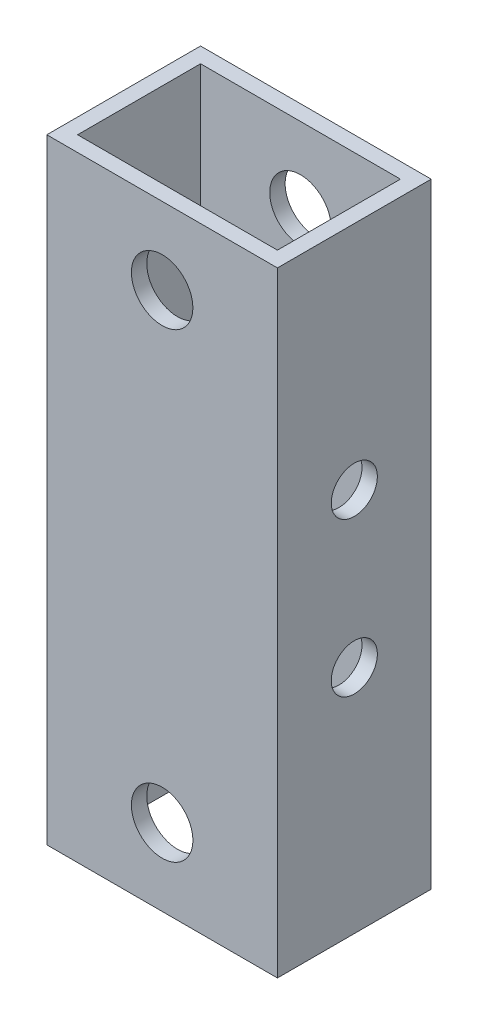
ISO-10303-21;
HEADER;
FILE_DESCRIPTION(('STEP AP214'),'2;1');
FILE_NAME('part.step','',(''),(''),'','','');
FILE_SCHEMA(('AUTOMOTIVE_DESIGN { 1 0 10303 214 1 1 1 1 }'));
ENDSEC;
DATA;
#1=APPLICATION_CONTEXT('core data for automotive mechanical design processes');
#2=APPLICATION_PROTOCOL_DEFINITION('international standard','automotive_design',2000,#1);
#3=PRODUCT_CONTEXT('',#1,'mechanical');
#4=PRODUCT('Part','Part','',(#3));
#5=PRODUCT_RELATED_PRODUCT_CATEGORY('part','',(#4));
#6=PRODUCT_DEFINITION_FORMATION('','',#4);
#7=PRODUCT_DEFINITION_CONTEXT('part definition',#1,'design');
#8=PRODUCT_DEFINITION('design','',#6,#7);
#9=PRODUCT_DEFINITION_SHAPE('','',#8);
#10=(LENGTH_UNIT() NAMED_UNIT(*) SI_UNIT(.MILLI.,.METRE.));
#11=(NAMED_UNIT(*) PLANE_ANGLE_UNIT() SI_UNIT($,.RADIAN.));
#12=(NAMED_UNIT(*) SI_UNIT($,.STERADIAN.) SOLID_ANGLE_UNIT());
#13=UNCERTAINTY_MEASURE_WITH_UNIT(LENGTH_MEASURE(1.E-05),#10,'distance_accuracy_value','');
#14=(GEOMETRIC_REPRESENTATION_CONTEXT(3) GLOBAL_UNCERTAINTY_ASSIGNED_CONTEXT((#13)) GLOBAL_UNIT_ASSIGNED_CONTEXT((#10,
#11,#12)) REPRESENTATION_CONTEXT('',''));
#15=CARTESIAN_POINT('',(0.,0.,0.));
#16=DIRECTION('',(0.,0.,1.));
#17=DIRECTION('',(1.,0.,0.));
#18=AXIS2_PLACEMENT_3D('',#15,#16,#17);
#19=CARTESIAN_POINT('',(0.,40.,0.));
#20=DIRECTION('',(0.,1.,0.));
#21=DIRECTION('',(0.,0.,1.));
#22=AXIS2_PLACEMENT_3D('',#19,#20,#21);
#23=PLANE('',#22);
#24=DIRECTION('',(0.,0.,1.));
#25=VECTOR('',#24,1.);
#26=CARTESIAN_POINT('',(0.,40.,0.));
#27=LINE('',#26,#25);
#28=CARTESIAN_POINT('',(0.,40.,-10.));
#29=VERTEX_POINT('',#28);
#30=CARTESIAN_POINT('',(0.,40.,0.));
#31=VERTEX_POINT('',#30);
#32=EDGE_CURVE('E164',#29,#31,#27,.T.);
#33=ORIENTED_EDGE('',*,*,#32,.T.);
#34=DIRECTION('',(1.,0.,0.));
#35=VECTOR('',#34,1.);
#36=CARTESIAN_POINT('',(0.,40.,0.));
#37=LINE('',#36,#35);
#38=CARTESIAN_POINT('',(15.,40.,0.));
#39=VERTEX_POINT('',#38);
#40=EDGE_CURVE('E167',#31,#39,#37,.T.);
#41=ORIENTED_EDGE('',*,*,#40,.T.);
#42=DIRECTION('',(0.,0.,-1.));
#43=VECTOR('',#42,1.);
#44=CARTESIAN_POINT('',(15.,40.,0.));
#45=LINE('',#44,#43);
#46=CARTESIAN_POINT('',(15.,40.,-10.));
#47=VERTEX_POINT('',#46);
#48=EDGE_CURVE('E170',#39,#47,#45,.T.);
#49=ORIENTED_EDGE('',*,*,#48,.T.);
#50=DIRECTION('',(-1.,0.,0.));
#51=VECTOR('',#50,1.);
#52=CARTESIAN_POINT('',(0.,40.,-10.));
#53=LINE('',#52,#51);
#54=EDGE_CURVE('E172',#47,#29,#53,.T.);
#55=ORIENTED_EDGE('',*,*,#54,.T.);
#56=EDGE_LOOP('',(#33,#41,#49,#55));
#57=FACE_BOUND('',#56,.T.);
#58=DIRECTION('',(1.,0.,0.));
#59=VECTOR('',#58,1.);
#60=CARTESIAN_POINT('',(0.,40.,-1.));
#61=LINE('',#60,#59);
#62=CARTESIAN_POINT('',(1.,40.,-1.));
#63=VERTEX_POINT('',#62);
#64=CARTESIAN_POINT('',(14.,40.,-1.));
#65=VERTEX_POINT('',#64);
#66=EDGE_CURVE('E134',#63,#65,#61,.T.);
#67=ORIENTED_EDGE('',*,*,#66,.F.);
#68=DIRECTION('',(0.,0.,1.));
#69=VECTOR('',#68,1.);
#70=CARTESIAN_POINT('',(1.,40.,0.));
#71=LINE('',#70,#69);
#72=CARTESIAN_POINT('',(1.,40.,-9.));
#73=VERTEX_POINT('',#72);
#74=EDGE_CURVE('E126',#73,#63,#71,.T.);
#75=ORIENTED_EDGE('',*,*,#74,.F.);
#76=DIRECTION('',(-1.,0.,0.));
#77=VECTOR('',#76,1.);
#78=CARTESIAN_POINT('',(0.,40.,-9.));
#79=LINE('',#78,#77);
#80=CARTESIAN_POINT('',(14.,40.,-9.));
#81=VERTEX_POINT('',#80);
#82=EDGE_CURVE('E148',#81,#73,#79,.T.);
#83=ORIENTED_EDGE('',*,*,#82,.F.);
#84=DIRECTION('',(0.,0.,-1.));
#85=VECTOR('',#84,1.);
#86=CARTESIAN_POINT('',(14.,40.,0.));
#87=LINE('',#86,#85);
#88=EDGE_CURVE('E146',#65,#81,#87,.T.);
#89=ORIENTED_EDGE('',*,*,#88,.F.);
#90=EDGE_LOOP('',(#67,#75,#83,#89));
#91=FACE_BOUND('',#90,.T.);
#92=ADVANCED_FACE('F59',(#57,#91),#23,.T.);
#93=CARTESIAN_POINT('',(0.,0.,0.));
#94=DIRECTION('',(0.,1.,0.));
#95=DIRECTION('',(0.,0.,1.));
#96=AXIS2_PLACEMENT_3D('',#93,#94,#95);
#97=PLANE('',#96);
#98=DIRECTION('',(0.,0.,1.));
#99=VECTOR('',#98,1.);
#100=CARTESIAN_POINT('',(0.,0.,0.));
#101=LINE('',#100,#99);
#102=CARTESIAN_POINT('',(0.,0.,-10.));
#103=VERTEX_POINT('',#102);
#104=CARTESIAN_POINT('',(0.,0.,0.));
#105=VERTEX_POINT('',#104);
#106=EDGE_CURVE('E142',#103,#105,#101,.T.);
#107=ORIENTED_EDGE('',*,*,#106,.F.);
#108=DIRECTION('',(-1.,0.,0.));
#109=VECTOR('',#108,1.);
#110=CARTESIAN_POINT('',(0.,0.,-10.));
#111=LINE('',#110,#109);
#112=CARTESIAN_POINT('',(15.,0.,-10.));
#113=VERTEX_POINT('',#112);
#114=EDGE_CURVE('E168',#113,#103,#111,.T.);
#115=ORIENTED_EDGE('',*,*,#114,.F.);
#116=DIRECTION('',(0.,0.,-1.));
#117=VECTOR('',#116,1.);
#118=CARTESIAN_POINT('',(15.,0.,0.));
#119=LINE('',#118,#117);
#120=CARTESIAN_POINT('',(15.,0.,0.));
#121=VERTEX_POINT('',#120);
#122=EDGE_CURVE('E179',#121,#113,#119,.T.);
#123=ORIENTED_EDGE('',*,*,#122,.F.);
#124=DIRECTION('',(1.,0.,0.));
#125=VECTOR('',#124,1.);
#126=CARTESIAN_POINT('',(0.,0.,0.));
#127=LINE('',#126,#125);
#128=EDGE_CURVE('E177',#105,#121,#127,.T.);
#129=ORIENTED_EDGE('',*,*,#128,.F.);
#130=EDGE_LOOP('',(#107,#115,#123,#129));
#131=FACE_BOUND('',#130,.T.);
#132=DIRECTION('',(0.,0.,1.));
#133=VECTOR('',#132,1.);
#134=CARTESIAN_POINT('',(1.,0.,0.));
#135=LINE('',#134,#133);
#136=CARTESIAN_POINT('',(1.,0.,-9.));
#137=VERTEX_POINT('',#136);
#138=CARTESIAN_POINT('',(1.,0.,-1.));
#139=VERTEX_POINT('',#138);
#140=EDGE_CURVE('E84',#137,#139,#135,.T.);
#141=ORIENTED_EDGE('',*,*,#140,.T.);
#142=DIRECTION('',(1.,0.,0.));
#143=VECTOR('',#142,1.);
#144=CARTESIAN_POINT('',(0.,0.,-1.));
#145=LINE('',#144,#143);
#146=CARTESIAN_POINT('',(14.,0.,-1.));
#147=VERTEX_POINT('',#146);
#148=EDGE_CURVE('E141',#139,#147,#145,.T.);
#149=ORIENTED_EDGE('',*,*,#148,.T.);
#150=DIRECTION('',(0.,0.,-1.));
#151=VECTOR('',#150,1.);
#152=CARTESIAN_POINT('',(14.,0.,0.));
#153=LINE('',#152,#151);
#154=CARTESIAN_POINT('',(14.,0.,-9.));
#155=VERTEX_POINT('',#154);
#156=EDGE_CURVE('E156',#147,#155,#153,.T.);
#157=ORIENTED_EDGE('',*,*,#156,.T.);
#158=DIRECTION('',(-1.,0.,0.));
#159=VECTOR('',#158,1.);
#160=CARTESIAN_POINT('',(0.,0.,-9.));
#161=LINE('',#160,#159);
#162=EDGE_CURVE('E135',#155,#137,#161,.T.);
#163=ORIENTED_EDGE('',*,*,#162,.T.);
#164=EDGE_LOOP('',(#141,#149,#157,#163));
#165=FACE_BOUND('',#164,.T.);
#166=ADVANCED_FACE('F256',(#131,#165),#97,.F.);
#167=CARTESIAN_POINT('',(0.,40.,0.));
#168=DIRECTION('',(1.,0.,0.));
#169=DIRECTION('',(0.,0.,-1.));
#170=AXIS2_PLACEMENT_3D('',#167,#168,#169);
#171=PLANE('',#170);
#172=CARTESIAN_POINT('',(0.,25.,-5.));
#173=DIRECTION('',(1.,0.,0.));
#174=DIRECTION('',(0.,0.,-1.));
#175=AXIS2_PLACEMENT_3D('',#172,#173,#174);
#176=CIRCLE('',#175,1.5);
#177=CARTESIAN_POINT('',(0.,25.,-6.5));
#178=VERTEX_POINT('',#177);
#179=EDGE_CURVE('E193',#178,#178,#176,.F.);
#180=ORIENTED_EDGE('',*,*,#179,.F.);
#181=EDGE_LOOP('',(#180));
#182=FACE_BOUND('',#181,.T.);
#183=CARTESIAN_POINT('',(0.,15.,-5.));
#184=DIRECTION('',(1.,0.,0.));
#185=DIRECTION('',(0.,0.,-1.));
#186=AXIS2_PLACEMENT_3D('',#183,#184,#185);
#187=CIRCLE('',#186,1.5);
#188=CARTESIAN_POINT('',(0.,15.,-6.5));
#189=VERTEX_POINT('',#188);
#190=EDGE_CURVE('E225',#189,#189,#187,.F.);
#191=ORIENTED_EDGE('',*,*,#190,.F.);
#192=EDGE_LOOP('',(#191));
#193=FACE_BOUND('',#192,.T.);
#194=ORIENTED_EDGE('',*,*,#106,.T.);
#195=DIRECTION('',(0.,-1.,0.));
#196=VECTOR('',#195,1.);
#197=CARTESIAN_POINT('',(0.,40.,0.));
#198=LINE('',#197,#196);
#199=EDGE_CURVE('E12',#31,#105,#198,.T.);
#200=ORIENTED_EDGE('',*,*,#199,.F.);
#201=ORIENTED_EDGE('',*,*,#32,.F.);
#202=DIRECTION('',(0.,-1.,0.));
#203=VECTOR('',#202,1.);
#204=CARTESIAN_POINT('',(0.,40.,-10.));
#205=LINE('',#204,#203);
#206=EDGE_CURVE('E174',#29,#103,#205,.T.);
#207=ORIENTED_EDGE('',*,*,#206,.T.);
#208=EDGE_LOOP('',(#194,#200,#201,#207));
#209=FACE_BOUND('',#208,.T.);
#210=ADVANCED_FACE('F61',(#182,#193,#209),#171,.F.);
#211=CARTESIAN_POINT('',(0.,40.,0.));
#212=DIRECTION('',(0.,0.,-1.));
#213=DIRECTION('',(-1.,0.,0.));
#214=AXIS2_PLACEMENT_3D('',#211,#212,#213);
#215=PLANE('',#214);
#216=CARTESIAN_POINT('',(7.50000000000001,35.,0.));
#217=DIRECTION('',(0.,0.,1.));
#218=DIRECTION('',(1.,0.,0.));
#219=AXIS2_PLACEMENT_3D('',#216,#217,#218);
#220=CIRCLE('',#219,2.);
#221=CARTESIAN_POINT('',(9.50000000000001,35.,0.));
#222=VERTEX_POINT('',#221);
#223=EDGE_CURVE('E205',#222,#222,#220,.T.);
#224=ORIENTED_EDGE('',*,*,#223,.F.);
#225=EDGE_LOOP('',(#224));
#226=FACE_BOUND('',#225,.T.);
#227=CARTESIAN_POINT('',(7.50000000000001,5.,0.));
#228=DIRECTION('',(0.,0.,1.));
#229=DIRECTION('',(-1.,0.,0.));
#230=AXIS2_PLACEMENT_3D('',#227,#228,#229);
#231=CIRCLE('',#230,2.);
#232=CARTESIAN_POINT('',(5.50000000000001,5.,0.));
#233=VERTEX_POINT('',#232);
#234=EDGE_CURVE('E213',#233,#233,#231,.T.);
#235=ORIENTED_EDGE('',*,*,#234,.F.);
#236=EDGE_LOOP('',(#235));
#237=FACE_BOUND('',#236,.T.);
#238=ORIENTED_EDGE('',*,*,#128,.T.);
#239=DIRECTION('',(0.,-1.,0.));
#240=VECTOR('',#239,1.);
#241=CARTESIAN_POINT('',(15.,40.,0.));
#242=LINE('',#241,#240);
#243=EDGE_CURVE('E68',#39,#121,#242,.T.);
#244=ORIENTED_EDGE('',*,*,#243,.F.);
#245=ORIENTED_EDGE('',*,*,#40,.F.);
#246=ORIENTED_EDGE('',*,*,#199,.T.);
#247=EDGE_LOOP('',(#238,#244,#245,#246));
#248=FACE_BOUND('',#247,.T.);
#249=ADVANCED_FACE('F255',(#226,#237,#248),#215,.F.);
#250=CARTESIAN_POINT('',(15.,40.,0.));
#251=DIRECTION('',(-1.,0.,0.));
#252=DIRECTION('',(0.,0.,1.));
#253=AXIS2_PLACEMENT_3D('',#250,#251,#252);
#254=PLANE('',#253);
#255=CARTESIAN_POINT('',(15.,25.,-5.));
#256=DIRECTION('',(1.,0.,0.));
#257=DIRECTION('',(0.,0.,-1.));
#258=AXIS2_PLACEMENT_3D('',#255,#256,#257);
#259=CIRCLE('',#258,1.5);
#260=CARTESIAN_POINT('',(15.,25.,-6.5));
#261=VERTEX_POINT('',#260);
#262=EDGE_CURVE('E222',#261,#261,#259,.T.);
#263=ORIENTED_EDGE('',*,*,#262,.F.);
#264=EDGE_LOOP('',(#263));
#265=FACE_BOUND('',#264,.T.);
#266=CARTESIAN_POINT('',(15.,15.,-5.));
#267=DIRECTION('',(1.,0.,0.));
#268=DIRECTION('',(0.,0.,-1.));
#269=AXIS2_PLACEMENT_3D('',#266,#267,#268);
#270=CIRCLE('',#269,1.5);
#271=CARTESIAN_POINT('',(15.,15.,-6.5));
#272=VERTEX_POINT('',#271);
#273=EDGE_CURVE('E221',#272,#272,#270,.T.);
#274=ORIENTED_EDGE('',*,*,#273,.F.);
#275=EDGE_LOOP('',(#274));
#276=FACE_BOUND('',#275,.T.);
#277=ORIENTED_EDGE('',*,*,#122,.T.);
#278=DIRECTION('',(0.,-1.,0.));
#279=VECTOR('',#278,1.);
#280=CARTESIAN_POINT('',(15.,40.,-10.));
#281=LINE('',#280,#279);
#282=EDGE_CURVE('E184',#47,#113,#281,.T.);
#283=ORIENTED_EDGE('',*,*,#282,.F.);
#284=ORIENTED_EDGE('',*,*,#48,.F.);
#285=ORIENTED_EDGE('',*,*,#243,.T.);
#286=EDGE_LOOP('',(#277,#283,#284,#285));
#287=FACE_BOUND('',#286,.T.);
#288=ADVANCED_FACE('F274',(#265,#276,#287),#254,.F.);
#289=CARTESIAN_POINT('',(0.,40.,-10.));
#290=DIRECTION('',(0.,0.,1.));
#291=DIRECTION('',(1.,0.,0.));
#292=AXIS2_PLACEMENT_3D('',#289,#290,#291);
#293=PLANE('',#292);
#294=CARTESIAN_POINT('',(7.50000000000001,35.,-10.));
#295=DIRECTION('',(0.,0.,1.));
#296=DIRECTION('',(1.,0.,0.));
#297=AXIS2_PLACEMENT_3D('',#294,#295,#296);
#298=CIRCLE('',#297,2.);
#299=CARTESIAN_POINT('',(9.50000000000001,35.,-10.));
#300=VERTEX_POINT('',#299);
#301=EDGE_CURVE('E199',#300,#300,#298,.F.);
#302=ORIENTED_EDGE('',*,*,#301,.F.);
#303=EDGE_LOOP('',(#302));
#304=FACE_BOUND('',#303,.T.);
#305=CARTESIAN_POINT('',(7.50000000000001,5.,-10.));
#306=DIRECTION('',(0.,0.,1.));
#307=DIRECTION('',(1.,0.,0.));
#308=AXIS2_PLACEMENT_3D('',#305,#306,#307);
#309=CIRCLE('',#308,2.);
#310=CARTESIAN_POINT('',(9.50000000000001,5.,-10.));
#311=VERTEX_POINT('',#310);
#312=EDGE_CURVE('E210',#311,#311,#309,.F.);
#313=ORIENTED_EDGE('',*,*,#312,.F.);
#314=EDGE_LOOP('',(#313));
#315=FACE_BOUND('',#314,.T.);
#316=ORIENTED_EDGE('',*,*,#114,.T.);
#317=ORIENTED_EDGE('',*,*,#206,.F.);
#318=ORIENTED_EDGE('',*,*,#54,.F.);
#319=ORIENTED_EDGE('',*,*,#282,.T.);
#320=EDGE_LOOP('',(#316,#317,#318,#319));
#321=FACE_BOUND('',#320,.T.);
#322=ADVANCED_FACE('F241',(#304,#315,#321),#293,.F.);
#323=CARTESIAN_POINT('',(1.,40.,0.));
#324=DIRECTION('',(1.,0.,0.));
#325=DIRECTION('',(0.,0.,-1.));
#326=AXIS2_PLACEMENT_3D('',#323,#324,#325);
#327=PLANE('',#326);
#328=CARTESIAN_POINT('',(1.,25.,-5.));
#329=DIRECTION('',(1.,0.,0.));
#330=DIRECTION('',(0.,0.,-1.));
#331=AXIS2_PLACEMENT_3D('',#328,#329,#330);
#332=CIRCLE('',#331,1.5);
#333=CARTESIAN_POINT('',(1.,25.,-6.5));
#334=VERTEX_POINT('',#333);
#335=EDGE_CURVE('E154',#334,#334,#332,.T.);
#336=ORIENTED_EDGE('',*,*,#335,.F.);
#337=EDGE_LOOP('',(#336));
#338=FACE_BOUND('',#337,.T.);
#339=CARTESIAN_POINT('',(1.,15.,-5.));
#340=DIRECTION('',(1.,0.,0.));
#341=DIRECTION('',(0.,0.,-1.));
#342=AXIS2_PLACEMENT_3D('',#339,#340,#341);
#343=CIRCLE('',#342,1.5);
#344=CARTESIAN_POINT('',(1.,15.,-6.5));
#345=VERTEX_POINT('',#344);
#346=EDGE_CURVE('E192',#345,#345,#343,.T.);
#347=ORIENTED_EDGE('',*,*,#346,.F.);
#348=EDGE_LOOP('',(#347));
#349=FACE_BOUND('',#348,.T.);
#350=ORIENTED_EDGE('',*,*,#140,.F.);
#351=DIRECTION('',(0.,-1.,0.));
#352=VECTOR('',#351,1.);
#353=CARTESIAN_POINT('',(1.,40.,-9.));
#354=LINE('',#353,#352);
#355=EDGE_CURVE('E130',#73,#137,#354,.T.);
#356=ORIENTED_EDGE('',*,*,#355,.F.);
#357=ORIENTED_EDGE('',*,*,#74,.T.);
#358=DIRECTION('',(0.,-1.,0.));
#359=VECTOR('',#358,1.);
#360=CARTESIAN_POINT('',(1.,40.,-1.));
#361=LINE('',#360,#359);
#362=EDGE_CURVE('E129',#63,#139,#361,.T.);
#363=ORIENTED_EDGE('',*,*,#362,.T.);
#364=EDGE_LOOP('',(#350,#356,#357,#363));
#365=FACE_BOUND('',#364,.T.);
#366=ADVANCED_FACE('F128',(#338,#349,#365),#327,.T.);
#367=CARTESIAN_POINT('',(0.,40.,-1.));
#368=DIRECTION('',(0.,0.,-1.));
#369=DIRECTION('',(-1.,0.,0.));
#370=AXIS2_PLACEMENT_3D('',#367,#368,#369);
#371=PLANE('',#370);
#372=CARTESIAN_POINT('',(7.50000000000001,35.,-1.));
#373=DIRECTION('',(0.,0.,-1.));
#374=DIRECTION('',(-1.,0.,0.));
#375=AXIS2_PLACEMENT_3D('',#372,#373,#374);
#376=CIRCLE('',#375,2.);
#377=CARTESIAN_POINT('',(5.50000000000001,35.,-1.));
#378=VERTEX_POINT('',#377);
#379=EDGE_CURVE('E218',#378,#378,#376,.T.);
#380=ORIENTED_EDGE('',*,*,#379,.F.);
#381=EDGE_LOOP('',(#380));
#382=FACE_BOUND('',#381,.T.);
#383=CARTESIAN_POINT('',(7.50000000000001,5.,-1.));
#384=DIRECTION('',(0.,0.,-1.));
#385=DIRECTION('',(-1.,0.,0.));
#386=AXIS2_PLACEMENT_3D('',#383,#384,#385);
#387=CIRCLE('',#386,2.);
#388=CARTESIAN_POINT('',(5.50000000000001,5.,-1.));
#389=VERTEX_POINT('',#388);
#390=EDGE_CURVE('E198',#389,#389,#387,.T.);
#391=ORIENTED_EDGE('',*,*,#390,.F.);
#392=EDGE_LOOP('',(#391));
#393=FACE_BOUND('',#392,.T.);
#394=ORIENTED_EDGE('',*,*,#148,.F.);
#395=ORIENTED_EDGE('',*,*,#362,.F.);
#396=ORIENTED_EDGE('',*,*,#66,.T.);
#397=DIRECTION('',(0.,-1.,0.));
#398=VECTOR('',#397,1.);
#399=CARTESIAN_POINT('',(14.,40.,-1.));
#400=LINE('',#399,#398);
#401=EDGE_CURVE('E143',#65,#147,#400,.T.);
#402=ORIENTED_EDGE('',*,*,#401,.T.);
#403=EDGE_LOOP('',(#394,#395,#396,#402));
#404=FACE_BOUND('',#403,.T.);
#405=ADVANCED_FACE('F138',(#382,#393,#404),#371,.T.);
#406=CARTESIAN_POINT('',(14.,40.,0.));
#407=DIRECTION('',(-1.,0.,0.));
#408=DIRECTION('',(0.,0.,1.));
#409=AXIS2_PLACEMENT_3D('',#406,#407,#408);
#410=PLANE('',#409);
#411=CARTESIAN_POINT('',(14.,25.,-5.));
#412=DIRECTION('',(-1.,0.,0.));
#413=DIRECTION('',(0.,0.,1.));
#414=AXIS2_PLACEMENT_3D('',#411,#412,#413);
#415=CIRCLE('',#414,1.5);
#416=CARTESIAN_POINT('',(14.,25.,-3.5));
#417=VERTEX_POINT('',#416);
#418=EDGE_CURVE('E194',#417,#417,#415,.T.);
#419=ORIENTED_EDGE('',*,*,#418,.F.);
#420=EDGE_LOOP('',(#419));
#421=FACE_BOUND('',#420,.T.);
#422=CARTESIAN_POINT('',(14.,15.,-5.));
#423=DIRECTION('',(-1.,0.,0.));
#424=DIRECTION('',(0.,0.,1.));
#425=AXIS2_PLACEMENT_3D('',#422,#423,#424);
#426=CIRCLE('',#425,1.5);
#427=CARTESIAN_POINT('',(14.,15.,-3.5));
#428=VERTEX_POINT('',#427);
#429=EDGE_CURVE('E189',#428,#428,#426,.T.);
#430=ORIENTED_EDGE('',*,*,#429,.F.);
#431=EDGE_LOOP('',(#430));
#432=FACE_BOUND('',#431,.T.);
#433=ORIENTED_EDGE('',*,*,#156,.F.);
#434=ORIENTED_EDGE('',*,*,#401,.F.);
#435=ORIENTED_EDGE('',*,*,#88,.T.);
#436=DIRECTION('',(0.,-1.,0.));
#437=VECTOR('',#436,1.);
#438=CARTESIAN_POINT('',(14.,40.,-9.));
#439=LINE('',#438,#437);
#440=EDGE_CURVE('E76',#81,#155,#439,.T.);
#441=ORIENTED_EDGE('',*,*,#440,.T.);
#442=EDGE_LOOP('',(#433,#434,#435,#441));
#443=FACE_BOUND('',#442,.T.);
#444=ADVANCED_FACE('F296',(#421,#432,#443),#410,.T.);
#445=CARTESIAN_POINT('',(0.,40.,-9.));
#446=DIRECTION('',(0.,0.,1.));
#447=DIRECTION('',(1.,0.,0.));
#448=AXIS2_PLACEMENT_3D('',#445,#446,#447);
#449=PLANE('',#448);
#450=CARTESIAN_POINT('',(7.50000000000001,35.,-9.));
#451=DIRECTION('',(0.,0.,1.));
#452=DIRECTION('',(1.,0.,0.));
#453=AXIS2_PLACEMENT_3D('',#450,#451,#452);
#454=CIRCLE('',#453,2.);
#455=CARTESIAN_POINT('',(9.50000000000001,35.,-9.));
#456=VERTEX_POINT('',#455);
#457=EDGE_CURVE('E63',#456,#456,#454,.T.);
#458=ORIENTED_EDGE('',*,*,#457,.F.);
#459=EDGE_LOOP('',(#458));
#460=FACE_BOUND('',#459,.T.);
#461=CARTESIAN_POINT('',(7.50000000000001,5.,-9.));
#462=DIRECTION('',(0.,0.,1.));
#463=DIRECTION('',(1.,0.,0.));
#464=AXIS2_PLACEMENT_3D('',#461,#462,#463);
#465=CIRCLE('',#464,2.);
#466=CARTESIAN_POINT('',(9.50000000000001,5.,-9.));
#467=VERTEX_POINT('',#466);
#468=EDGE_CURVE('E196',#467,#467,#465,.T.);
#469=ORIENTED_EDGE('',*,*,#468,.F.);
#470=EDGE_LOOP('',(#469));
#471=FACE_BOUND('',#470,.T.);
#472=ORIENTED_EDGE('',*,*,#162,.F.);
#473=ORIENTED_EDGE('',*,*,#440,.F.);
#474=ORIENTED_EDGE('',*,*,#82,.T.);
#475=ORIENTED_EDGE('',*,*,#355,.T.);
#476=EDGE_LOOP('',(#472,#473,#474,#475));
#477=FACE_BOUND('',#476,.T.);
#478=ADVANCED_FACE('F300',(#460,#471,#477),#449,.T.);
#479=CARTESIAN_POINT('',(-4.24264068711929,15.,-5.));
#480=DIRECTION('',(1.,0.,0.));
#481=DIRECTION('',(0.,0.,-1.));
#482=AXIS2_PLACEMENT_3D('',#479,#480,#481);
#483=CYLINDRICAL_SURFACE('',#482,1.5);
#484=ORIENTED_EDGE('',*,*,#429,.T.);
#485=EDGE_LOOP('',(#484));
#486=FACE_BOUND('',#485,.T.);
#487=ORIENTED_EDGE('',*,*,#273,.T.);
#488=EDGE_LOOP('',(#487));
#489=FACE_BOUND('',#488,.T.);
#490=ADVANCED_FACE('F250',(#486,#489),#483,.F.);
#491=CARTESIAN_POINT('',(-4.24264068711929,25.,-5.));
#492=DIRECTION('',(1.,0.,0.));
#493=DIRECTION('',(0.,0.,-1.));
#494=AXIS2_PLACEMENT_3D('',#491,#492,#493);
#495=CYLINDRICAL_SURFACE('',#494,1.5);
#496=ORIENTED_EDGE('',*,*,#418,.T.);
#497=EDGE_LOOP('',(#496));
#498=FACE_BOUND('',#497,.T.);
#499=ORIENTED_EDGE('',*,*,#262,.T.);
#500=EDGE_LOOP('',(#499));
#501=FACE_BOUND('',#500,.T.);
#502=ADVANCED_FACE('F248',(#498,#501),#495,.F.);
#503=ORIENTED_EDGE('',*,*,#346,.T.);
#504=EDGE_LOOP('',(#503));
#505=FACE_BOUND('',#504,.T.);
#506=ORIENTED_EDGE('',*,*,#190,.T.);
#507=EDGE_LOOP('',(#506));
#508=FACE_BOUND('',#507,.T.);
#509=ADVANCED_FACE('F245',(#505,#508),#483,.F.);
#510=ORIENTED_EDGE('',*,*,#335,.T.);
#511=EDGE_LOOP('',(#510));
#512=FACE_BOUND('',#511,.T.);
#513=ORIENTED_EDGE('',*,*,#179,.T.);
#514=EDGE_LOOP('',(#513));
#515=FACE_BOUND('',#514,.T.);
#516=ADVANCED_FACE('F236',(#512,#515),#495,.F.);
#517=CARTESIAN_POINT('',(7.50000000000001,5.,-15.6568542494924));
#518=DIRECTION('',(0.,0.,1.));
#519=DIRECTION('',(1.,0.,0.));
#520=AXIS2_PLACEMENT_3D('',#517,#518,#519);
#521=CYLINDRICAL_SURFACE('',#520,2.);
#522=ORIENTED_EDGE('',*,*,#468,.T.);
#523=EDGE_LOOP('',(#522));
#524=FACE_BOUND('',#523,.T.);
#525=ORIENTED_EDGE('',*,*,#312,.T.);
#526=EDGE_LOOP('',(#525));
#527=FACE_BOUND('',#526,.T.);
#528=ADVANCED_FACE('F310',(#524,#527),#521,.F.);
#529=CARTESIAN_POINT('',(7.50000000000001,35.,-15.6568542494924));
#530=DIRECTION('',(0.,0.,1.));
#531=DIRECTION('',(1.,0.,0.));
#532=AXIS2_PLACEMENT_3D('',#529,#530,#531);
#533=CYLINDRICAL_SURFACE('',#532,2.);
#534=ORIENTED_EDGE('',*,*,#457,.T.);
#535=EDGE_LOOP('',(#534));
#536=FACE_BOUND('',#535,.T.);
#537=ORIENTED_EDGE('',*,*,#301,.T.);
#538=EDGE_LOOP('',(#537));
#539=FACE_BOUND('',#538,.T.);
#540=ADVANCED_FACE('F313',(#536,#539),#533,.F.);
#541=ORIENTED_EDGE('',*,*,#390,.T.);
#542=EDGE_LOOP('',(#541));
#543=FACE_BOUND('',#542,.T.);
#544=ORIENTED_EDGE('',*,*,#234,.T.);
#545=EDGE_LOOP('',(#544));
#546=FACE_BOUND('',#545,.T.);
#547=ADVANCED_FACE('F314',(#543,#546),#521,.F.);
#548=ORIENTED_EDGE('',*,*,#379,.T.);
#549=EDGE_LOOP('',(#548));
#550=FACE_BOUND('',#549,.T.);
#551=ORIENTED_EDGE('',*,*,#223,.T.);
#552=EDGE_LOOP('',(#551));
#553=FACE_BOUND('',#552,.T.);
#554=ADVANCED_FACE('F317',(#550,#553),#533,.F.);
#555=CLOSED_SHELL('',(#92,#166,#210,#249,#288,#322,#366,#405,#444,#478,#490,#502,#509,#516,#528,
#540,#547,#554));
#556=MANIFOLD_SOLID_BREP('B2',#555);
#557=ADVANCED_BREP_SHAPE_REPRESENTATION('',(#18,#556),#14);
#558=SHAPE_DEFINITION_REPRESENTATION(#9,#557);
ENDSEC;
END-ISO-10303-21;
